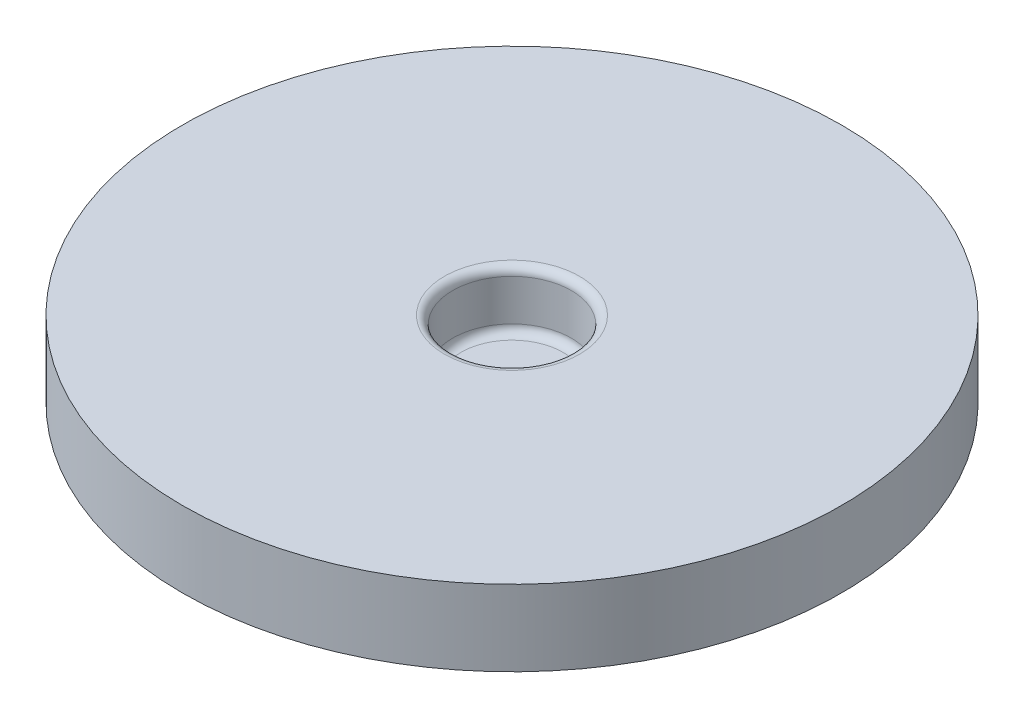
ISO-10303-21;
HEADER;
FILE_DESCRIPTION(('STEP AP214'),'2;1');
FILE_NAME('part.step','',(''),(''),'','','');
FILE_SCHEMA(('AUTOMOTIVE_DESIGN { 1 0 10303 214 1 1 1 1 }'));
ENDSEC;
DATA;
#1=APPLICATION_CONTEXT('core data for automotive mechanical design processes');
#2=APPLICATION_PROTOCOL_DEFINITION('international standard','automotive_design',2000,#1);
#3=PRODUCT_CONTEXT('',#1,'mechanical');
#4=PRODUCT('Part','Part','',(#3));
#5=PRODUCT_RELATED_PRODUCT_CATEGORY('part','',(#4));
#6=PRODUCT_DEFINITION_FORMATION('','',#4);
#7=PRODUCT_DEFINITION_CONTEXT('part definition',#1,'design');
#8=PRODUCT_DEFINITION('design','',#6,#7);
#9=PRODUCT_DEFINITION_SHAPE('','',#8);
#10=(LENGTH_UNIT() NAMED_UNIT(*) SI_UNIT(.MILLI.,.METRE.));
#11=(NAMED_UNIT(*) PLANE_ANGLE_UNIT() SI_UNIT($,.RADIAN.));
#12=(NAMED_UNIT(*) SI_UNIT($,.STERADIAN.) SOLID_ANGLE_UNIT());
#13=UNCERTAINTY_MEASURE_WITH_UNIT(LENGTH_MEASURE(1.E-05),#10,'distance_accuracy_value','');
#14=(GEOMETRIC_REPRESENTATION_CONTEXT(3) GLOBAL_UNCERTAINTY_ASSIGNED_CONTEXT((#13)) GLOBAL_UNIT_ASSIGNED_CONTEXT((#10,
#11,#12)) REPRESENTATION_CONTEXT('',''));
#15=CARTESIAN_POINT('',(0.,0.,0.));
#16=DIRECTION('',(0.,0.,1.));
#17=DIRECTION('',(1.,0.,0.));
#18=AXIS2_PLACEMENT_3D('',#15,#16,#17);
#19=CARTESIAN_POINT('',(0.,4.6,0.));
#20=DIRECTION('',(0.,-1.,0.));
#21=DIRECTION('',(0.,0.,-1.));
#22=AXIS2_PLACEMENT_3D('',#19,#20,#21);
#23=CYLINDRICAL_SURFACE('',#22,20.);
#24=CARTESIAN_POINT('',(0.,4.6,0.));
#25=DIRECTION('',(0.,1.,0.));
#26=DIRECTION('',(0.,0.,1.));
#27=AXIS2_PLACEMENT_3D('',#24,#25,#26);
#28=CIRCLE('',#27,20.);
#29=CARTESIAN_POINT('',(0.,4.6,20.));
#30=VERTEX_POINT('',#29);
#31=EDGE_CURVE('E54',#30,#30,#28,.T.);
#32=ORIENTED_EDGE('',*,*,#31,.F.);
#33=EDGE_LOOP('',(#32));
#34=FACE_BOUND('',#33,.T.);
#35=CARTESIAN_POINT('',(0.,0.,0.));
#36=DIRECTION('',(0.,1.,0.));
#37=DIRECTION('',(0.,0.,1.));
#38=AXIS2_PLACEMENT_3D('',#35,#36,#37);
#39=CIRCLE('',#38,20.);
#40=CARTESIAN_POINT('',(0.,0.,20.));
#41=VERTEX_POINT('',#40);
#42=EDGE_CURVE('E55',#41,#41,#39,.T.);
#43=ORIENTED_EDGE('',*,*,#42,.T.);
#44=EDGE_LOOP('',(#43));
#45=FACE_BOUND('',#44,.T.);
#46=ADVANCED_FACE('F34',(#34,#45),#23,.T.);
#47=CARTESIAN_POINT('',(0.,4.6,0.));
#48=DIRECTION('',(0.,1.,0.));
#49=DIRECTION('',(0.,0.,1.));
#50=AXIS2_PLACEMENT_3D('',#47,#48,#49);
#51=PLANE('',#50);
#52=CARTESIAN_POINT('',(0.,4.6,0.));
#53=DIRECTION('',(0.,1.,0.));
#54=DIRECTION('',(0.,0.,1.));
#55=AXIS2_PLACEMENT_3D('',#52,#53,#54);
#56=CIRCLE('',#55,4.1);
#57=CARTESIAN_POINT('',(0.,4.6,4.1));
#58=VERTEX_POINT('',#57);
#59=EDGE_CURVE('E41',#58,#58,#56,.F.);
#60=ORIENTED_EDGE('',*,*,#59,.T.);
#61=EDGE_LOOP('',(#60));
#62=FACE_BOUND('',#61,.T.);
#63=ORIENTED_EDGE('',*,*,#31,.T.);
#64=EDGE_LOOP('',(#63));
#65=FACE_BOUND('',#64,.T.);
#66=ADVANCED_FACE('F61',(#62,#65),#51,.T.);
#67=CARTESIAN_POINT('',(0.,0.,0.));
#68=DIRECTION('',(0.,1.,0.));
#69=DIRECTION('',(0.,0.,1.));
#70=AXIS2_PLACEMENT_3D('',#67,#68,#69);
#71=PLANE('',#70);
#72=ORIENTED_EDGE('',*,*,#42,.F.);
#73=EDGE_LOOP('',(#72));
#74=FACE_BOUND('',#73,.T.);
#75=ADVANCED_FACE('F68',(#74),#71,.F.);
#76=CARTESIAN_POINT('',(0.,1.1,0.));
#77=DIRECTION('',(0.,1.,0.));
#78=DIRECTION('',(0.,0.,1.));
#79=AXIS2_PLACEMENT_3D('',#76,#77,#78);
#80=CYLINDRICAL_SURFACE('',#79,3.6);
#81=CARTESIAN_POINT('',(0.,4.1,0.));
#82=DIRECTION('',(0.,1.,0.));
#83=DIRECTION('',(0.,0.,1.));
#84=AXIS2_PLACEMENT_3D('',#81,#82,#83);
#85=CIRCLE('',#84,3.6);
#86=CARTESIAN_POINT('',(0.,4.1,3.6));
#87=VERTEX_POINT('',#86);
#88=EDGE_CURVE('E45',#87,#87,#85,.T.);
#89=ORIENTED_EDGE('',*,*,#88,.T.);
#90=EDGE_LOOP('',(#89));
#91=FACE_BOUND('',#90,.T.);
#92=CARTESIAN_POINT('',(0.,1.6,0.));
#93=DIRECTION('',(0.,1.,0.));
#94=DIRECTION('',(0.,0.,1.));
#95=AXIS2_PLACEMENT_3D('',#92,#93,#94);
#96=CIRCLE('',#95,3.6);
#97=CARTESIAN_POINT('',(0.,1.6,3.6));
#98=VERTEX_POINT('',#97);
#99=EDGE_CURVE('E49',#98,#98,#96,.F.);
#100=ORIENTED_EDGE('',*,*,#99,.T.);
#101=EDGE_LOOP('',(#100));
#102=FACE_BOUND('',#101,.T.);
#103=ADVANCED_FACE('F70',(#91,#102),#80,.F.);
#104=CARTESIAN_POINT('',(0.,1.1,0.));
#105=DIRECTION('',(0.,1.,0.));
#106=DIRECTION('',(0.,0.,1.));
#107=AXIS2_PLACEMENT_3D('',#104,#105,#106);
#108=PLANE('',#107);
#109=CARTESIAN_POINT('',(0.,1.1,0.));
#110=DIRECTION('',(0.,1.,0.));
#111=DIRECTION('',(0.,0.,1.));
#112=AXIS2_PLACEMENT_3D('',#109,#110,#111);
#113=CIRCLE('',#112,3.1);
#114=CARTESIAN_POINT('',(0.,1.1,3.1));
#115=VERTEX_POINT('',#114);
#116=EDGE_CURVE('E10',#115,#115,#113,.T.);
#117=ORIENTED_EDGE('',*,*,#116,.T.);
#118=EDGE_LOOP('',(#117));
#119=FACE_BOUND('',#118,.T.);
#120=ADVANCED_FACE('F76',(#119),#108,.T.);
#121=CARTESIAN_POINT('',(0.,4.1,0.));
#122=DIRECTION('',(0.,1.,0.));
#123=DIRECTION('',(0.,0.,1.));
#124=AXIS2_PLACEMENT_3D('',#121,#122,#123);
#125=TOROIDAL_SURFACE('',#124,4.1,0.5);
#126=ORIENTED_EDGE('',*,*,#59,.F.);
#127=EDGE_LOOP('',(#126));
#128=FACE_BOUND('',#127,.T.);
#129=ORIENTED_EDGE('',*,*,#88,.F.);
#130=EDGE_LOOP('',(#129));
#131=FACE_BOUND('',#130,.T.);
#132=ADVANCED_FACE('F80',(#128,#131),#125,.T.);
#133=CARTESIAN_POINT('',(0.,1.6,0.));
#134=DIRECTION('',(0.,1.,0.));
#135=DIRECTION('',(0.,0.,1.));
#136=AXIS2_PLACEMENT_3D('',#133,#134,#135);
#137=TOROIDAL_SURFACE('',#136,3.1,0.5);
#138=ORIENTED_EDGE('',*,*,#99,.F.);
#139=EDGE_LOOP('',(#138));
#140=FACE_BOUND('',#139,.T.);
#141=ORIENTED_EDGE('',*,*,#116,.F.);
#142=EDGE_LOOP('',(#141));
#143=FACE_BOUND('',#142,.T.);
#144=ADVANCED_FACE('F36',(#140,#143),#137,.F.);
#145=CLOSED_SHELL('',(#46,#66,#75,#103,#120,#132,#144));
#146=MANIFOLD_SOLID_BREP('B2',#145);
#147=ADVANCED_BREP_SHAPE_REPRESENTATION('',(#18,#146),#14);
#148=SHAPE_DEFINITION_REPRESENTATION(#9,#147);
ENDSEC;
END-ISO-10303-21;
